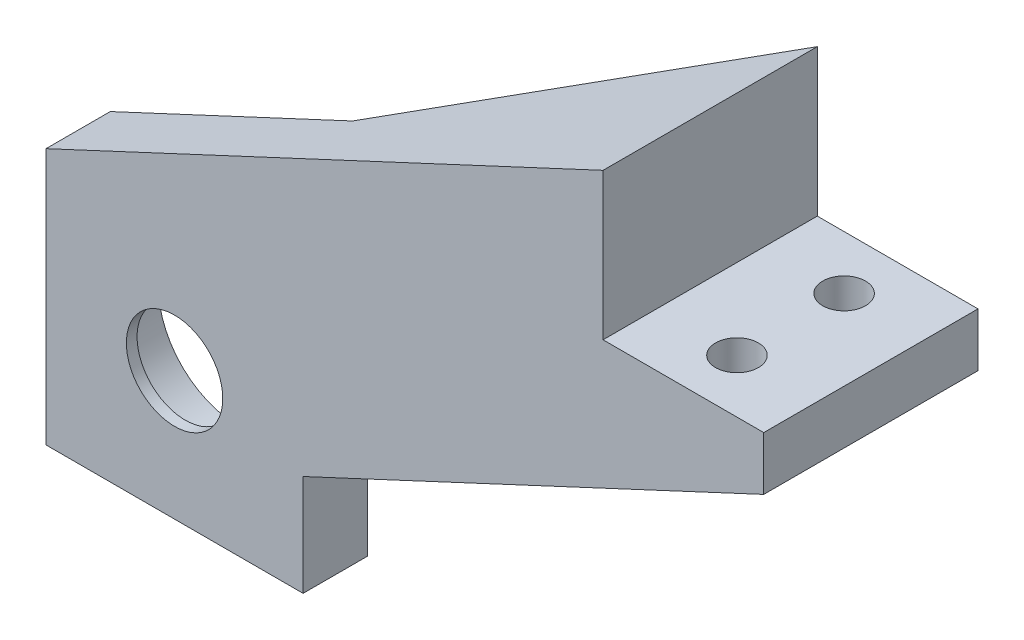
ISO-10303-21;
HEADER;
FILE_DESCRIPTION(('STEP AP214'),'2;1');
FILE_NAME('part.step','',(''),(''),'','','');
FILE_SCHEMA(('AUTOMOTIVE_DESIGN { 1 0 10303 214 1 1 1 1 }'));
ENDSEC;
DATA;
#1=APPLICATION_CONTEXT('core data for automotive mechanical design processes');
#2=APPLICATION_PROTOCOL_DEFINITION('international standard','automotive_design',2000,#1);
#3=PRODUCT_CONTEXT('',#1,'mechanical');
#4=PRODUCT('Part','Part','',(#3));
#5=PRODUCT_RELATED_PRODUCT_CATEGORY('part','',(#4));
#6=PRODUCT_DEFINITION_FORMATION('','',#4);
#7=PRODUCT_DEFINITION_CONTEXT('part definition',#1,'design');
#8=PRODUCT_DEFINITION('design','',#6,#7);
#9=PRODUCT_DEFINITION_SHAPE('','',#8);
#10=(LENGTH_UNIT() NAMED_UNIT(*) SI_UNIT(.MILLI.,.METRE.));
#11=(NAMED_UNIT(*) PLANE_ANGLE_UNIT() SI_UNIT($,.RADIAN.));
#12=(NAMED_UNIT(*) SI_UNIT($,.STERADIAN.) SOLID_ANGLE_UNIT());
#13=UNCERTAINTY_MEASURE_WITH_UNIT(LENGTH_MEASURE(1.E-05),#10,'distance_accuracy_value','');
#14=(GEOMETRIC_REPRESENTATION_CONTEXT(3) GLOBAL_UNCERTAINTY_ASSIGNED_CONTEXT((#13)) GLOBAL_UNIT_ASSIGNED_CONTEXT((#10,
#11,#12)) REPRESENTATION_CONTEXT('',''));
#15=CARTESIAN_POINT('',(0.,0.,0.));
#16=DIRECTION('',(0.,0.,1.));
#17=DIRECTION('',(1.,0.,0.));
#18=AXIS2_PLACEMENT_3D('',#15,#16,#17);
#19=CARTESIAN_POINT('',(0.,22.5000000000014,-87.5362950464834));
#20=DIRECTION('',(0.,1.,0.));
#21=DIRECTION('',(-1.,0.,0.));
#22=AXIS2_PLACEMENT_3D('',#19,#20,#21);
#23=PLANE('',#22);
#24=CARTESIAN_POINT('',(47.5000000000003,22.5000000000012,-4.00000000000001));
#25=DIRECTION('',(0.,-1.,0.));
#26=DIRECTION('',(0.,0.,-1.));
#27=AXIS2_PLACEMENT_3D('',#24,#25,#26);
#28=CIRCLE('',#27,2.);
#29=CARTESIAN_POINT('',(47.5000000000003,22.5000000000012,-6.));
#30=VERTEX_POINT('',#29);
#31=EDGE_CURVE('E245',#30,#30,#28,.F.);
#32=ORIENTED_EDGE('',*,*,#31,.F.);
#33=EDGE_LOOP('',(#32));
#34=FACE_BOUND('',#33,.T.);
#35=CARTESIAN_POINT('',(47.5000000000003,22.5000000000012,-14.));
#36=DIRECTION('',(0.,-1.,0.));
#37=DIRECTION('',(0.,0.,-1.));
#38=AXIS2_PLACEMENT_3D('',#35,#36,#37);
#39=CIRCLE('',#38,2.);
#40=CARTESIAN_POINT('',(47.5000000000003,22.5000000000012,-16.));
#41=VERTEX_POINT('',#40);
#42=EDGE_CURVE('E276',#41,#41,#39,.T.);
#43=ORIENTED_EDGE('',*,*,#42,.T.);
#44=EDGE_LOOP('',(#43));
#45=FACE_BOUND('',#44,.T.);
#46=DIRECTION('',(-1.,0.,0.));
#47=VECTOR('',#46,1.);
#48=CARTESIAN_POINT('',(0.,22.5000000000012,-19.0000000000001));
#49=LINE('',#48,#47);
#50=CARTESIAN_POINT('',(55.0000000000003,22.5000000000012,-19.));
#51=VERTEX_POINT('',#50);
#52=CARTESIAN_POINT('',(40.0000000000003,22.5000000000012,-19.));
#53=VERTEX_POINT('',#52);
#54=EDGE_CURVE('E202',#51,#53,#49,.T.);
#55=ORIENTED_EDGE('',*,*,#54,.T.);
#56=DIRECTION('',(0.,0.,1.));
#57=VECTOR('',#56,1.);
#58=CARTESIAN_POINT('',(40.0000000000003,22.5000000000012,-87.5362950464834));
#59=LINE('',#58,#57);
#60=CARTESIAN_POINT('',(40.0000000000003,22.5000000000012,1.));
#61=VERTEX_POINT('',#60);
#62=EDGE_CURVE('E314',#53,#61,#59,.T.);
#63=ORIENTED_EDGE('',*,*,#62,.T.);
#64=DIRECTION('',(-1.,0.,0.));
#65=VECTOR('',#64,1.);
#66=CARTESIAN_POINT('',(0.,22.5000000000014,1.));
#67=LINE('',#66,#65);
#68=CARTESIAN_POINT('',(55.0000000000003,22.5000000000011,1.));
#69=VERTEX_POINT('',#68);
#70=EDGE_CURVE('E310',#69,#61,#67,.T.);
#71=ORIENTED_EDGE('',*,*,#70,.F.);
#72=DIRECTION('',(0.,0.,1.));
#73=VECTOR('',#72,1.);
#74=CARTESIAN_POINT('',(55.0000000000003,22.5000000000011,-87.5362950464834));
#75=LINE('',#74,#73);
#76=EDGE_CURVE('E320',#51,#69,#75,.T.);
#77=ORIENTED_EDGE('',*,*,#76,.F.);
#78=EDGE_LOOP('',(#55,#63,#71,#77));
#79=FACE_BOUND('',#78,.T.);
#80=ADVANCED_FACE('F35',(#34,#45,#79),#23,.T.);
#81=CARTESIAN_POINT('',(3.12045185632848,-6.69183060101346,-87.5362950464834));
#82=DIRECTION('',(-0.422618261740692,0.906307787036653,0.));
#83=DIRECTION('',(-0.906307787036654,-0.422618261740692,0.));
#84=AXIS2_PLACEMENT_3D('',#81,#82,#83);
#85=PLANE('',#84);
#86=DIRECTION('',(-0.803018297611856,-0.37445358181499,-0.4636228302904));
#87=VECTOR('',#86,1.);
#88=CARTESIAN_POINT('',(-16.9360766604947,-16.044343444412,-45.2436380897875));
#89=LINE('',#88,#87);
#90=CARTESIAN_POINT('',(51.0000000000003,15.6347693673812,-6.02072594216368));
#91=VERTEX_POINT('',#90);
#92=CARTESIAN_POINT('',(47.5000000000003,14.0026925638387,-8.04145188432738));
#93=VERTEX_POINT('',#92);
#94=EDGE_CURVE('E43',#91,#93,#89,.T.);
#95=ORIENTED_EDGE('',*,*,#94,.T.);
#96=DIRECTION('',(-0.803018297611856,-0.37445358181499,0.463622830290401));
#97=VECTOR('',#96,1.);
#98=CARTESIAN_POINT('',(42.2554045129276,11.5570975242916,-5.01348326807526));
#99=LINE('',#98,#97);
#100=CARTESIAN_POINT('',(44.0000000000003,12.3706157602962,-6.02072594216369));
#101=VERTEX_POINT('',#100);
#102=EDGE_CURVE('E11',#93,#101,#99,.T.);
#103=ORIENTED_EDGE('',*,*,#102,.T.);
#104=DIRECTION('',(0.,0.,1.));
#105=VECTOR('',#104,1.);
#106=CARTESIAN_POINT('',(44.0000000000003,12.3706157602962,-87.5362950464834));
#107=LINE('',#106,#105);
#108=CARTESIAN_POINT('',(44.0000000000003,12.3706157602962,-1.97927405783631));
#109=VERTEX_POINT('',#108);
#110=EDGE_CURVE('E361',#101,#109,#107,.T.);
#111=ORIENTED_EDGE('',*,*,#110,.T.);
#112=DIRECTION('',(0.803018297611856,0.37445358181499,0.4636228302904));
#113=VECTOR('',#112,1.);
#114=CARTESIAN_POINT('',(-19.9453224632255,-17.4475778074961,-38.8981231953971));
#115=LINE('',#114,#113);
#116=CARTESIAN_POINT('',(47.5000000000003,14.0026925638387,0.0414518843273807));
#117=VERTEX_POINT('',#116);
#118=EDGE_CURVE('E364',#109,#117,#115,.T.);
#119=ORIENTED_EDGE('',*,*,#118,.T.);
#120=DIRECTION('',(0.803018297611856,0.37445358181499,-0.4636228302904));
#121=VECTOR('',#120,1.);
#122=CARTESIAN_POINT('',(45.2646503156582,12.9603318873757,1.33203162631521));
#123=LINE('',#122,#121);
#124=CARTESIAN_POINT('',(51.0000000000003,15.6347693673812,-1.97927405783632));
#125=VERTEX_POINT('',#124);
#126=EDGE_CURVE('E367',#117,#125,#123,.T.);
#127=ORIENTED_EDGE('',*,*,#126,.T.);
#128=DIRECTION('',(0.,0.,-1.));
#129=VECTOR('',#128,1.);
#130=CARTESIAN_POINT('',(51.0000000000003,15.6347693673812,-87.5362950464834));
#131=LINE('',#130,#129);
#132=EDGE_CURVE('E370',#125,#91,#131,.T.);
#133=ORIENTED_EDGE('',*,*,#132,.T.);
#134=EDGE_LOOP('',(#95,#103,#111,#119,#127,#133));
#135=FACE_BOUND('',#134,.T.);
#136=DIRECTION('',(0.,0.,1.));
#137=VECTOR('',#136,1.);
#138=CARTESIAN_POINT('',(12.,-2.55122930066351,-87.5362950464834));
#139=LINE('',#138,#137);
#140=CARTESIAN_POINT('',(12.,-2.55122930066349,-5.));
#141=VERTEX_POINT('',#140);
#142=CARTESIAN_POINT('',(12.,-2.55122930066351,1.));
#143=VERTEX_POINT('',#142);
#144=EDGE_CURVE('E299',#141,#143,#139,.T.);
#145=ORIENTED_EDGE('',*,*,#144,.F.);
#146=DIRECTION('',(0.906307787036654,0.422618261740692,0.));
#147=VECTOR('',#146,1.);
#148=CARTESIAN_POINT('',(-12.8853882092916,-14.155476398816,-5.));
#149=LINE('',#148,#147);
#150=CARTESIAN_POINT('',(10.6202551890186,-3.19461487232375,-5.));
#151=VERTEX_POINT('',#150);
#152=EDGE_CURVE('E284',#151,#141,#149,.T.);
#153=ORIENTED_EDGE('',*,*,#152,.F.);
#154=DIRECTION('',(0.832030557119117,0.387982220603606,-0.396478181638721));
#155=VECTOR('',#154,1.);
#156=CARTESIAN_POINT('',(-10.8398296172416,-13.2016167621384,5.22613331805873));
#157=LINE('',#156,#155);
#158=CARTESIAN_POINT('',(40.0000000000003,10.5053851276763,-19.));
#159=VERTEX_POINT('',#158);
#160=EDGE_CURVE('E200',#151,#159,#157,.T.);
#161=ORIENTED_EDGE('',*,*,#160,.T.);
#162=DIRECTION('',(0.906307787036654,0.422618261740692,0.));
#163=VECTOR('',#162,1.);
#164=CARTESIAN_POINT('',(-12.8853882092915,-14.155476398816,-19.0000000000001));
#165=LINE('',#164,#163);
#166=CARTESIAN_POINT('',(55.0000000000003,17.5000000000011,-19.));
#167=VERTEX_POINT('',#166);
#168=EDGE_CURVE('E281',#159,#167,#165,.T.);
#169=ORIENTED_EDGE('',*,*,#168,.T.);
#170=DIRECTION('',(0.,0.,1.));
#171=VECTOR('',#170,1.);
#172=CARTESIAN_POINT('',(55.0000000000003,17.5000000000011,-87.5362950464834));
#173=LINE('',#172,#171);
#174=CARTESIAN_POINT('',(55.0000000000003,17.5000000000011,1.));
#175=VERTEX_POINT('',#174);
#176=EDGE_CURVE('E286',#167,#175,#173,.T.);
#177=ORIENTED_EDGE('',*,*,#176,.T.);
#178=DIRECTION('',(-0.906307787036653,-0.422618261740692,0.));
#179=VECTOR('',#178,1.);
#180=CARTESIAN_POINT('',(3.12045185632848,-6.69183060101346,1.));
#181=LINE('',#180,#179);
#182=EDGE_CURVE('E321',#175,#143,#181,.T.);
#183=ORIENTED_EDGE('',*,*,#182,.T.);
#184=EDGE_LOOP('',(#145,#153,#161,#169,#177,#183));
#185=FACE_BOUND('',#184,.T.);
#186=DIRECTION('',(0.,0.,1.));
#187=VECTOR('',#186,1.);
#188=CARTESIAN_POINT('',(51.0000000000003,15.6347693673812,-87.5362950464834));
#189=LINE('',#188,#187);
#190=CARTESIAN_POINT('',(51.0000000000003,15.6347693673812,-16.0207259421637));
#191=VERTEX_POINT('',#190);
#192=CARTESIAN_POINT('',(51.0000000000003,15.6347693673812,-11.9792740578363));
#193=VERTEX_POINT('',#192);
#194=EDGE_CURVE('E359',#191,#193,#189,.T.);
#195=ORIENTED_EDGE('',*,*,#194,.F.);
#196=DIRECTION('',(0.803018297611856,0.37445358181499,0.4636228302904));
#197=VECTOR('',#196,1.);
#198=CARTESIAN_POINT('',(-13.2131005013568,-14.3082911502776,-53.0941768021227));
#199=LINE('',#198,#197);
#200=CARTESIAN_POINT('',(47.5000000000003,14.0026925638387,-18.0414518843274));
#201=VERTEX_POINT('',#200);
#202=EDGE_CURVE('E347',#201,#191,#199,.T.);
#203=ORIENTED_EDGE('',*,*,#202,.F.);
#204=DIRECTION('',(0.803018297611856,0.37445358181499,-0.4636228302904));
#205=VECTOR('',#204,1.);
#206=CARTESIAN_POINT('',(38.5324283537896,9.82104523015715,-12.8640219804104));
#207=LINE('',#206,#205);
#208=CARTESIAN_POINT('',(44.0000000000003,12.3706157602962,-16.0207259421637));
#209=VERTEX_POINT('',#208);
#210=EDGE_CURVE('E351',#209,#201,#207,.T.);
#211=ORIENTED_EDGE('',*,*,#210,.F.);
#212=DIRECTION('',(0.,0.,-1.));
#213=VECTOR('',#212,1.);
#214=CARTESIAN_POINT('',(44.0000000000003,12.3706157602962,-87.5362950464834));
#215=LINE('',#214,#213);
#216=CARTESIAN_POINT('',(44.0000000000003,12.3706157602962,-11.9792740578363));
#217=VERTEX_POINT('',#216);
#218=EDGE_CURVE('E353',#217,#209,#215,.T.);
#219=ORIENTED_EDGE('',*,*,#218,.F.);
#220=DIRECTION('',(-0.803018297611856,-0.37445358181499,-0.463622830290401));
#221=VECTOR('',#220,1.);
#222=CARTESIAN_POINT('',(-16.2223463040876,-15.7115255133617,-46.7486619077324));
#223=LINE('',#222,#221);
#224=CARTESIAN_POINT('',(47.5000000000003,14.0026925638387,-9.95854811567263));
#225=VERTEX_POINT('',#224);
#226=EDGE_CURVE('E355',#225,#217,#223,.T.);
#227=ORIENTED_EDGE('',*,*,#226,.F.);
#228=DIRECTION('',(-0.803018297611856,-0.37445358181499,0.4636228302904));
#229=VECTOR('',#228,1.);
#230=CARTESIAN_POINT('',(41.5416741565203,11.2242795932412,-6.51850708602002));
#231=LINE('',#230,#229);
#232=EDGE_CURVE('E357',#193,#225,#231,.T.);
#233=ORIENTED_EDGE('',*,*,#232,.F.);
#234=EDGE_LOOP('',(#195,#203,#211,#219,#227,#233));
#235=FACE_BOUND('',#234,.T.);
#236=ADVANCED_FACE('F374',(#135,#185,#235),#85,.F.);
#237=CARTESIAN_POINT('',(47.5000000000003,-12.,-4.));
#238=DIRECTION('',(0.,1.,0.));
#239=DIRECTION('',(0.,0.,1.));
#240=AXIS2_PLACEMENT_3D('',#237,#238,#239);
#241=CYLINDRICAL_SURFACE('',#240,2.);
#242=ORIENTED_EDGE('',*,*,#31,.T.);
#243=EDGE_LOOP('',(#242));
#244=FACE_BOUND('',#243,.T.);
#245=CARTESIAN_POINT('',(47.5000000000003,19.5000000000012,-4.00000000000001));
#246=DIRECTION('',(0.,-1.,0.));
#247=DIRECTION('',(0.,0.,-1.));
#248=AXIS2_PLACEMENT_3D('',#245,#246,#247);
#249=CIRCLE('',#248,2.);
#250=CARTESIAN_POINT('',(47.5000000000003,19.5000000000012,-6.));
#251=VERTEX_POINT('',#250);
#252=EDGE_CURVE('E231',#251,#251,#249,.F.);
#253=ORIENTED_EDGE('',*,*,#252,.F.);
#254=EDGE_LOOP('',(#253));
#255=FACE_BOUND('',#254,.T.);
#256=ADVANCED_FACE('F418',(#244,#255),#241,.F.);
#257=CARTESIAN_POINT('',(47.5000000000003,-12.,-14.));
#258=DIRECTION('',(0.,1.,0.));
#259=DIRECTION('',(0.,0.,1.));
#260=AXIS2_PLACEMENT_3D('',#257,#258,#259);
#261=CYLINDRICAL_SURFACE('',#260,2.);
#262=ORIENTED_EDGE('',*,*,#42,.F.);
#263=EDGE_LOOP('',(#262));
#264=FACE_BOUND('',#263,.T.);
#265=CARTESIAN_POINT('',(47.5000000000003,19.5000000000012,-14.));
#266=DIRECTION('',(0.,-1.,0.));
#267=DIRECTION('',(0.,0.,-1.));
#268=AXIS2_PLACEMENT_3D('',#265,#266,#267);
#269=CIRCLE('',#268,2.);
#270=CARTESIAN_POINT('',(47.5000000000003,19.5000000000012,-16.));
#271=VERTEX_POINT('',#270);
#272=EDGE_CURVE('E210',#271,#271,#269,.T.);
#273=ORIENTED_EDGE('',*,*,#272,.T.);
#274=EDGE_LOOP('',(#273));
#275=FACE_BOUND('',#274,.T.);
#276=ADVANCED_FACE('F456',(#264,#275),#261,.F.);
#277=CARTESIAN_POINT('',(0.,0.,-5.));
#278=DIRECTION('',(0.,0.,-1.));
#279=DIRECTION('',(0.,-1.,0.));
#280=AXIS2_PLACEMENT_3D('',#277,#278,#279);
#281=PLANE('',#280);
#282=CARTESIAN_POINT('',(0.,0.,-5.));
#283=DIRECTION('',(0.,0.,-1.));
#284=DIRECTION('',(-1.,0.,0.));
#285=AXIS2_PLACEMENT_3D('',#282,#283,#284);
#286=CIRCLE('',#285,7.5);
#287=CARTESIAN_POINT('',(7.5,0.,-5.));
#288=VERTEX_POINT('',#287);
#289=EDGE_CURVE('E344',#288,#288,#286,.F.);
#290=ORIENTED_EDGE('',*,*,#289,.T.);
#291=EDGE_LOOP('',(#290));
#292=FACE_BOUND('',#291,.T.);
#293=DIRECTION('',(0.,1.,0.));
#294=VECTOR('',#293,1.);
#295=CARTESIAN_POINT('',(10.6202551890186,-41.7882805870946,-4.99999999999999));
#296=LINE('',#295,#294);
#297=CARTESIAN_POINT('',(10.6202551890186,22.5000000000012,-5.));
#298=VERTEX_POINT('',#297);
#299=EDGE_CURVE('E184',#151,#298,#296,.T.);
#300=ORIENTED_EDGE('',*,*,#299,.F.);
#301=ORIENTED_EDGE('',*,*,#152,.T.);
#302=DIRECTION('',(0.,-1.,0.));
#303=VECTOR('',#302,1.);
#304=CARTESIAN_POINT('',(12.,0.,-5.));
#305=LINE('',#304,#303);
#306=CARTESIAN_POINT('',(12.,-12.,-5.));
#307=VERTEX_POINT('',#306);
#308=EDGE_CURVE('E303',#141,#307,#305,.T.);
#309=ORIENTED_EDGE('',*,*,#308,.T.);
#310=DIRECTION('',(1.,0.,0.));
#311=VECTOR('',#310,1.);
#312=CARTESIAN_POINT('',(0.,-12.,-5.));
#313=LINE('',#312,#311);
#314=CARTESIAN_POINT('',(-12.,-12.,-5.));
#315=VERTEX_POINT('',#314);
#316=EDGE_CURVE('E298',#315,#307,#313,.T.);
#317=ORIENTED_EDGE('',*,*,#316,.F.);
#318=DIRECTION('',(0.,1.,0.));
#319=VECTOR('',#318,1.);
#320=CARTESIAN_POINT('',(-12.,0.,-5.));
#321=LINE('',#320,#319);
#322=CARTESIAN_POINT('',(-12.,11.9520017759417,-5.));
#323=VERTEX_POINT('',#322);
#324=EDGE_CURVE('E186',#315,#323,#321,.T.);
#325=ORIENTED_EDGE('',*,*,#324,.T.);
#326=DIRECTION('',(-0.906307787036653,-0.422618261740692,0.));
#327=VECTOR('',#326,1.);
#328=CARTESIAN_POINT('',(-6.72115661418476,14.4135668729481,-5.));
#329=LINE('',#328,#327);
#330=EDGE_CURVE('E181',#298,#323,#329,.T.);
#331=ORIENTED_EDGE('',*,*,#330,.F.);
#332=EDGE_LOOP('',(#300,#301,#309,#317,#325,#331));
#333=FACE_BOUND('',#332,.T.);
#334=ADVANCED_FACE('F183',(#292,#333),#281,.T.);
#335=CARTESIAN_POINT('',(0.,0.,-33.2842712474619));
#336=DIRECTION('',(0.,0.,1.));
#337=DIRECTION('',(1.,0.,0.));
#338=AXIS2_PLACEMENT_3D('',#335,#336,#337);
#339=CYLINDRICAL_SURFACE('',#338,7.5);
#340=CARTESIAN_POINT('',(0.,0.,0.));
#341=DIRECTION('',(0.,0.,1.));
#342=DIRECTION('',(1.,0.,0.));
#343=AXIS2_PLACEMENT_3D('',#340,#341,#342);
#344=CIRCLE('',#343,7.5);
#345=CARTESIAN_POINT('',(7.5,0.,0.));
#346=VERTEX_POINT('',#345);
#347=EDGE_CURVE('E341',#346,#346,#344,.T.);
#348=CARTESIAN_POINT('',(7.5,0.,0.));
#349=CARTESIAN_POINT('',(7.5,0.,-0.0520833333333392));
#350=CARTESIAN_POINT('',(7.5,0.,-0.104166666666671));
#351=CARTESIAN_POINT('',(7.5,0.,-0.208333333333338));
#352=CARTESIAN_POINT('',(7.5,0.,-0.260416666666673));
#353=CARTESIAN_POINT('',(7.5,0.,-0.364583333333339));
#354=CARTESIAN_POINT('',(7.5,0.,-0.416666666666672));
#355=CARTESIAN_POINT('',(7.5,0.,-0.520833333333338));
#356=CARTESIAN_POINT('',(7.5,0.,-0.572916666666673));
#357=CARTESIAN_POINT('',(7.5,0.,-0.67708333333334));
#358=CARTESIAN_POINT('',(7.5,0.,-0.729166666666672));
#359=CARTESIAN_POINT('',(7.5,0.,-0.833333333333339));
#360=CARTESIAN_POINT('',(7.5,0.,-0.885416666666673));
#361=CARTESIAN_POINT('',(7.5,0.,-0.98958333333334));
#362=CARTESIAN_POINT('',(7.5,0.,-1.04166666666667));
#363=CARTESIAN_POINT('',(7.5,0.,-1.14583333333334));
#364=CARTESIAN_POINT('',(7.5,0.,-1.19791666666667));
#365=CARTESIAN_POINT('',(7.5,0.,-1.30208333333334));
#366=CARTESIAN_POINT('',(7.5,0.,-1.35416666666667));
#367=CARTESIAN_POINT('',(7.5,0.,-1.45833333333334));
#368=CARTESIAN_POINT('',(7.5,0.,-1.51041666666667));
#369=CARTESIAN_POINT('',(7.5,0.,-1.61458333333334));
#370=CARTESIAN_POINT('',(7.5,0.,-1.66666666666667));
#371=CARTESIAN_POINT('',(7.5,0.,-1.77083333333334));
#372=CARTESIAN_POINT('',(7.5,0.,-1.82291666666667));
#373=CARTESIAN_POINT('',(7.5,0.,-1.92708333333334));
#374=CARTESIAN_POINT('',(7.5,0.,-1.97916666666667));
#375=CARTESIAN_POINT('',(7.5,0.,-2.08333333333334));
#376=CARTESIAN_POINT('',(7.5,0.,-2.13541666666667));
#377=CARTESIAN_POINT('',(7.5,0.,-2.23958333333334));
#378=CARTESIAN_POINT('',(7.5,0.,-2.29166666666667));
#379=CARTESIAN_POINT('',(7.5,0.,-2.39583333333334));
#380=CARTESIAN_POINT('',(7.5,0.,-2.44791666666667));
#381=CARTESIAN_POINT('',(7.5,0.,-2.55208333333334));
#382=CARTESIAN_POINT('',(7.5,0.,-2.60416666666667));
#383=CARTESIAN_POINT('',(7.5,0.,-2.70833333333334));
#384=CARTESIAN_POINT('',(7.5,0.,-2.76041666666667));
#385=CARTESIAN_POINT('',(7.5,0.,-2.86458333333334));
#386=CARTESIAN_POINT('',(7.5,0.,-2.91666666666667));
#387=CARTESIAN_POINT('',(7.5,0.,-3.02083333333334));
#388=CARTESIAN_POINT('',(7.5,0.,-3.07291666666667));
#389=CARTESIAN_POINT('',(7.5,0.,-3.17708333333334));
#390=CARTESIAN_POINT('',(7.5,0.,-3.22916666666667));
#391=CARTESIAN_POINT('',(7.5,0.,-3.33333333333334));
#392=CARTESIAN_POINT('',(7.5,0.,-3.38541666666667));
#393=CARTESIAN_POINT('',(7.5,0.,-3.48958333333334));
#394=CARTESIAN_POINT('',(7.5,0.,-3.54166666666667));
#395=CARTESIAN_POINT('',(7.5,0.,-3.64583333333334));
#396=CARTESIAN_POINT('',(7.5,0.,-3.69791666666667));
#397=CARTESIAN_POINT('',(7.5,0.,-3.80208333333333));
#398=CARTESIAN_POINT('',(7.5,0.,-3.85416666666667));
#399=CARTESIAN_POINT('',(7.5,0.,-3.95833333333334));
#400=CARTESIAN_POINT('',(7.5,0.,-4.01041666666667));
#401=CARTESIAN_POINT('',(7.5,0.,-4.11458333333333));
#402=CARTESIAN_POINT('',(7.5,0.,-4.16666666666667));
#403=CARTESIAN_POINT('',(7.5,0.,-4.27083333333333));
#404=CARTESIAN_POINT('',(7.5,0.,-4.32291666666667));
#405=CARTESIAN_POINT('',(7.5,0.,-4.42708333333333));
#406=CARTESIAN_POINT('',(7.5,0.,-4.47916666666667));
#407=CARTESIAN_POINT('',(7.5,0.,-4.58333333333333));
#408=CARTESIAN_POINT('',(7.5,0.,-4.63541666666667));
#409=CARTESIAN_POINT('',(7.5,0.,-4.73958333333333));
#410=CARTESIAN_POINT('',(7.5,0.,-4.79166666666667));
#411=CARTESIAN_POINT('',(7.5,0.,-4.89583333333333));
#412=CARTESIAN_POINT('',(7.5,0.,-4.94791666666667));
#413=CARTESIAN_POINT('',(7.5,0.,-5.));
#414=B_SPLINE_CURVE_WITH_KNOTS('',3,(#348,#349,#350,#351,#352,#353,#354,#355,#356,#357,#358,
#359,#360,#361,#362,#363,#364,#365,#366,#367,#368,#369,#370,#371,#372,#373,#374,#375,#376,#377,
#378,#379,#380,#381,#382,#383,#384,#385,#386,#387,#388,#389,#390,#391,#392,#393,#394,#395,#396,
#397,#398,#399,#400,#401,#402,#403,#404,#405,#406,#407,#408,#409,#410,#411,#412,#413),
.UNSPECIFIED.,.F.,.F.,(4,2,2,2,2,2,2,2,2,2,2,2,2,2,2,2,2,2,2,2,2,2,2,2,2,2,2,2,2,2,2,2,4),(0.,
0.156249999999997,0.3125,0.468749999999997,0.625000000000001,0.781249999999997,
0.937500000000001,1.09375,1.25,1.40625,1.5625,1.71875,1.875,2.03125,2.1875,2.34375,2.5,2.65625,
2.8125,2.96875,3.125,3.28125,3.4375,3.59375,3.74999999999999,3.90625,4.06249999999999,
4.21874999999999,4.37499999999999,4.53124999999999,4.68749999999999,4.84374999999999,
4.99999999999999),.UNSPECIFIED.);
#415=EDGE_CURVE('BSEAM37',#346,#288,#414,.T.);
#416=ORIENTED_EDGE('',*,*,#347,.T.);
#417=ORIENTED_EDGE('',*,*,#289,.F.);
#418=ORIENTED_EDGE('',*,*,#415,.T.);
#419=ORIENTED_EDGE('',*,*,#415,.F.);
#420=EDGE_LOOP('',(#416,#418,#417,#419));
#421=FACE_BOUND('',#420,.T.);
#422=ADVANCED_FACE('F37',(#421),#339,.F.);
#423=CARTESIAN_POINT('',(0.,0.,0.));
#424=DIRECTION('',(0.,0.,1.));
#425=DIRECTION('',(1.,0.,0.));
#426=AXIS2_PLACEMENT_3D('',#423,#424,#425);
#427=PLANE('',#426);
#428=CARTESIAN_POINT('',(0.,0.,0.));
#429=DIRECTION('',(0.,0.,1.));
#430=DIRECTION('',(1.,0.,0.));
#431=AXIS2_PLACEMENT_3D('',#428,#429,#430);
#432=CIRCLE('',#431,4.5);
#433=CARTESIAN_POINT('',(4.5,0.,0.));
#434=VERTEX_POINT('',#433);
#435=EDGE_CURVE('E328',#434,#434,#432,.T.);
#436=ORIENTED_EDGE('',*,*,#435,.T.);
#437=EDGE_LOOP('',(#436));
#438=FACE_BOUND('',#437,.T.);
#439=ORIENTED_EDGE('',*,*,#347,.F.);
#440=EDGE_LOOP('',(#439));
#441=FACE_BOUND('',#440,.T.);
#442=ADVANCED_FACE('F449',(#438,#441),#427,.F.);
#443=CARTESIAN_POINT('',(0.,0.,1.));
#444=DIRECTION('',(0.,0.,-1.));
#445=DIRECTION('',(-1.,0.,0.));
#446=AXIS2_PLACEMENT_3D('',#443,#444,#445);
#447=CYLINDRICAL_SURFACE('',#446,4.5);
#448=CARTESIAN_POINT('',(0.,0.,1.));
#449=DIRECTION('',(0.,0.,1.));
#450=DIRECTION('',(1.,0.,0.));
#451=AXIS2_PLACEMENT_3D('',#448,#449,#450);
#452=CIRCLE('',#451,4.5);
#453=CARTESIAN_POINT('',(4.5,0.,1.));
#454=VERTEX_POINT('',#453);
#455=EDGE_CURVE('E338',#454,#454,#452,.T.);
#456=ORIENTED_EDGE('',*,*,#455,.T.);
#457=EDGE_LOOP('',(#456));
#458=FACE_BOUND('',#457,.T.);
#459=ORIENTED_EDGE('',*,*,#435,.F.);
#460=EDGE_LOOP('',(#459));
#461=FACE_BOUND('',#460,.T.);
#462=ADVANCED_FACE('F447',(#458,#461),#447,.F.);
#463=CARTESIAN_POINT('',(0.,0.,1.));
#464=DIRECTION('',(0.,0.,1.));
#465=DIRECTION('',(1.,0.,0.));
#466=AXIS2_PLACEMENT_3D('',#463,#464,#465);
#467=PLANE('',#466);
#468=ORIENTED_EDGE('',*,*,#455,.F.);
#469=EDGE_LOOP('',(#468));
#470=FACE_BOUND('',#469,.T.);
#471=ORIENTED_EDGE('',*,*,#182,.F.);
#472=DIRECTION('',(0.,1.,0.));
#473=VECTOR('',#472,1.);
#474=CARTESIAN_POINT('',(55.0000000000004,1.5265566588596E-13,1.));
#475=LINE('',#474,#473);
#476=EDGE_CURVE('E317',#175,#69,#475,.T.);
#477=ORIENTED_EDGE('',*,*,#476,.T.);
#478=ORIENTED_EDGE('',*,*,#70,.T.);
#479=DIRECTION('',(0.,-1.,0.));
#480=VECTOR('',#479,1.);
#481=CARTESIAN_POINT('',(40.0000000000004,1.41816809714894E-13,1.));
#482=LINE('',#481,#480);
#483=CARTESIAN_POINT('',(40.0000000000003,36.2000000000012,1.));
#484=VERTEX_POINT('',#483);
#485=EDGE_CURVE('E311',#484,#61,#482,.T.);
#486=ORIENTED_EDGE('',*,*,#485,.F.);
#487=DIRECTION('',(-0.906307787036653,-0.422618261740692,0.));
#488=VECTOR('',#487,1.);
#489=CARTESIAN_POINT('',(-6.72115661418476,14.4135668729481,1.));
#490=LINE('',#489,#488);
#491=CARTESIAN_POINT('',(-12.,11.9520017759417,1.));
#492=VERTEX_POINT('',#491);
#493=EDGE_CURVE('E304',#484,#492,#490,.T.);
#494=ORIENTED_EDGE('',*,*,#493,.T.);
#495=DIRECTION('',(0.,1.,0.));
#496=VECTOR('',#495,1.);
#497=CARTESIAN_POINT('',(-12.,0.,1.));
#498=LINE('',#497,#496);
#499=CARTESIAN_POINT('',(-12.,-12.,1.));
#500=VERTEX_POINT('',#499);
#501=EDGE_CURVE('E191',#500,#492,#498,.T.);
#502=ORIENTED_EDGE('',*,*,#501,.F.);
#503=DIRECTION('',(1.,0.,0.));
#504=VECTOR('',#503,1.);
#505=CARTESIAN_POINT('',(0.,-12.,1.));
#506=LINE('',#505,#504);
#507=CARTESIAN_POINT('',(12.,-12.,1.));
#508=VERTEX_POINT('',#507);
#509=EDGE_CURVE('E300',#500,#508,#506,.T.);
#510=ORIENTED_EDGE('',*,*,#509,.T.);
#511=DIRECTION('',(0.,-1.,0.));
#512=VECTOR('',#511,1.);
#513=CARTESIAN_POINT('',(12.,0.,1.));
#514=LINE('',#513,#512);
#515=EDGE_CURVE('E295',#143,#508,#514,.T.);
#516=ORIENTED_EDGE('',*,*,#515,.F.);
#517=EDGE_LOOP('',(#471,#477,#478,#486,#494,#502,#510,#516));
#518=FACE_BOUND('',#517,.T.);
#519=ADVANCED_FACE('F442',(#470,#518),#467,.T.);
#520=CARTESIAN_POINT('',(12.,0.,-87.5362950464834));
#521=DIRECTION('',(-1.,0.,0.));
#522=DIRECTION('',(0.,-1.,0.));
#523=AXIS2_PLACEMENT_3D('',#520,#521,#522);
#524=PLANE('',#523);
#525=ORIENTED_EDGE('',*,*,#308,.F.);
#526=ORIENTED_EDGE('',*,*,#144,.T.);
#527=ORIENTED_EDGE('',*,*,#515,.T.);
#528=DIRECTION('',(0.,0.,1.));
#529=VECTOR('',#528,1.);
#530=CARTESIAN_POINT('',(12.,-12.,-87.5362950464834));
#531=LINE('',#530,#529);
#532=EDGE_CURVE('E327',#307,#508,#531,.T.);
#533=ORIENTED_EDGE('',*,*,#532,.F.);
#534=EDGE_LOOP('',(#525,#526,#527,#533));
#535=FACE_BOUND('',#534,.T.);
#536=ADVANCED_FACE('F439',(#535),#524,.F.);
#537=CARTESIAN_POINT('',(0.,-12.,-87.5362950464834));
#538=DIRECTION('',(0.,-1.,0.));
#539=DIRECTION('',(0.,0.,-1.));
#540=AXIS2_PLACEMENT_3D('',#537,#538,#539);
#541=PLANE('',#540);
#542=DIRECTION('',(0.,0.,1.));
#543=VECTOR('',#542,1.);
#544=CARTESIAN_POINT('',(-12.,-12.,-87.5362950464834));
#545=LINE('',#544,#543);
#546=EDGE_CURVE('E307',#315,#500,#545,.T.);
#547=ORIENTED_EDGE('',*,*,#546,.F.);
#548=ORIENTED_EDGE('',*,*,#316,.T.);
#549=ORIENTED_EDGE('',*,*,#532,.T.);
#550=ORIENTED_EDGE('',*,*,#509,.F.);
#551=EDGE_LOOP('',(#547,#548,#549,#550));
#552=FACE_BOUND('',#551,.T.);
#553=ADVANCED_FACE('F435',(#552),#541,.T.);
#554=CARTESIAN_POINT('',(-12.,0.,-87.5362950464834));
#555=DIRECTION('',(1.,0.,0.));
#556=DIRECTION('',(0.,1.,0.));
#557=AXIS2_PLACEMENT_3D('',#554,#555,#556);
#558=PLANE('',#557);
#559=ORIENTED_EDGE('',*,*,#324,.F.);
#560=ORIENTED_EDGE('',*,*,#546,.T.);
#561=ORIENTED_EDGE('',*,*,#501,.T.);
#562=DIRECTION('',(0.,0.,1.));
#563=VECTOR('',#562,1.);
#564=CARTESIAN_POINT('',(-12.,11.9520017759417,-87.5362950464834));
#565=LINE('',#564,#563);
#566=EDGE_CURVE('E190',#323,#492,#565,.T.);
#567=ORIENTED_EDGE('',*,*,#566,.F.);
#568=EDGE_LOOP('',(#559,#560,#561,#567));
#569=FACE_BOUND('',#568,.T.);
#570=ADVANCED_FACE('F432',(#569),#558,.F.);
#571=CARTESIAN_POINT('',(-6.72115661418476,14.4135668729481,-87.5362950464834));
#572=DIRECTION('',(-0.422618261740692,0.906307787036653,0.));
#573=DIRECTION('',(-0.906307787036653,-0.422618261740692,0.));
#574=AXIS2_PLACEMENT_3D('',#571,#572,#573);
#575=PLANE('',#574);
#576=DIRECTION('',(0.,0.,1.));
#577=VECTOR('',#576,1.);
#578=CARTESIAN_POINT('',(40.0000000000003,36.2000000000012,-87.5362950464834));
#579=LINE('',#578,#577);
#580=CARTESIAN_POINT('',(40.0000000000003,36.2000000000012,-19.));
#581=VERTEX_POINT('',#580);
#582=EDGE_CURVE('E206',#581,#484,#579,.T.);
#583=ORIENTED_EDGE('',*,*,#582,.F.);
#584=DIRECTION('',(-0.832030557119117,-0.387982220603606,0.396478181638721));
#585=VECTOR('',#584,1.);
#586=CARTESIAN_POINT('',(14.878932392875,24.4858537937694,-7.02933964326688));
#587=LINE('',#586,#585);
#588=EDGE_CURVE('E198',#581,#298,#587,.T.);
#589=ORIENTED_EDGE('',*,*,#588,.T.);
#590=ORIENTED_EDGE('',*,*,#330,.T.);
#591=ORIENTED_EDGE('',*,*,#566,.T.);
#592=ORIENTED_EDGE('',*,*,#493,.F.);
#593=EDGE_LOOP('',(#583,#589,#590,#591,#592));
#594=FACE_BOUND('',#593,.T.);
#595=ADVANCED_FACE('F204',(#594),#575,.T.);
#596=CARTESIAN_POINT('',(40.0000000000004,1.41816809714894E-13,-87.5362950464834));
#597=DIRECTION('',(-1.,0.,0.));
#598=DIRECTION('',(0.,-1.,0.));
#599=AXIS2_PLACEMENT_3D('',#596,#597,#598);
#600=PLANE('',#599);
#601=ORIENTED_EDGE('',*,*,#62,.F.);
#602=DIRECTION('',(0.,-1.,0.));
#603=VECTOR('',#602,1.);
#604=CARTESIAN_POINT('',(40.0000000000003,63.5770940688242,-19.));
#605=LINE('',#604,#603);
#606=EDGE_CURVE('E208',#581,#53,#605,.T.);
#607=ORIENTED_EDGE('',*,*,#606,.F.);
#608=ORIENTED_EDGE('',*,*,#582,.T.);
#609=ORIENTED_EDGE('',*,*,#485,.T.);
#610=EDGE_LOOP('',(#601,#607,#608,#609));
#611=FACE_BOUND('',#610,.T.);
#612=ADVANCED_FACE('F426',(#611),#600,.F.);
#613=CARTESIAN_POINT('',(55.0000000000004,1.5265566588596E-13,-87.5362950464834));
#614=DIRECTION('',(1.,0.,0.));
#615=DIRECTION('',(0.,1.,0.));
#616=AXIS2_PLACEMENT_3D('',#613,#614,#615);
#617=PLANE('',#616);
#618=ORIENTED_EDGE('',*,*,#176,.F.);
#619=DIRECTION('',(0.,1.,0.));
#620=VECTOR('',#619,1.);
#621=CARTESIAN_POINT('',(55.0000000000003,-41.7882805870946,-19.));
#622=LINE('',#621,#620);
#623=EDGE_CURVE('E201',#167,#51,#622,.T.);
#624=ORIENTED_EDGE('',*,*,#623,.T.);
#625=ORIENTED_EDGE('',*,*,#76,.T.);
#626=ORIENTED_EDGE('',*,*,#476,.F.);
#627=EDGE_LOOP('',(#618,#624,#625,#626));
#628=FACE_BOUND('',#627,.T.);
#629=ADVANCED_FACE('F424',(#628),#617,.T.);
#630=CARTESIAN_POINT('',(0.,-41.7882805870946,-19.0000000000001));
#631=DIRECTION('',(0.,0.,-1.));
#632=DIRECTION('',(-1.,0.,0.));
#633=AXIS2_PLACEMENT_3D('',#630,#631,#632);
#634=PLANE('',#633);
#635=ORIENTED_EDGE('',*,*,#168,.F.);
#636=DIRECTION('',(0.,1.,0.));
#637=VECTOR('',#636,1.);
#638=CARTESIAN_POINT('',(40.0000000000003,-41.7882805870946,-19.));
#639=LINE('',#638,#637);
#640=EDGE_CURVE('E291',#159,#53,#639,.T.);
#641=ORIENTED_EDGE('',*,*,#640,.T.);
#642=ORIENTED_EDGE('',*,*,#54,.F.);
#643=ORIENTED_EDGE('',*,*,#623,.F.);
#644=EDGE_LOOP('',(#635,#641,#642,#643));
#645=FACE_BOUND('',#644,.T.);
#646=ADVANCED_FACE('F478',(#645),#634,.T.);
#647=CARTESIAN_POINT('',(0.023591958148741,-41.7882805870946,0.049508979285819));
#648=DIRECTION('',(-0.430175153144217,0.,-0.902745444528717));
#649=DIRECTION('',(-0.902745444528717,0.,0.430175153144217));
#650=AXIS2_PLACEMENT_3D('',#647,#648,#649);
#651=PLANE('',#650);
#652=ORIENTED_EDGE('',*,*,#160,.F.);
#653=ORIENTED_EDGE('',*,*,#299,.T.);
#654=ORIENTED_EDGE('',*,*,#588,.F.);
#655=ORIENTED_EDGE('',*,*,#606,.T.);
#656=ORIENTED_EDGE('',*,*,#640,.F.);
#657=EDGE_LOOP('',(#652,#653,#654,#655,#656));
#658=FACE_BOUND('',#657,.T.);
#659=ADVANCED_FACE('F196',(#658),#651,.T.);
#660=CARTESIAN_POINT('',(51.0000000000003,-12.,0.));
#661=DIRECTION('',(-1.,0.,0.));
#662=DIRECTION('',(0.,-1.,0.));
#663=AXIS2_PLACEMENT_3D('',#660,#661,#662);
#664=PLANE('',#663);
#665=ORIENTED_EDGE('',*,*,#194,.T.);
#666=DIRECTION('',(0.,1.,0.));
#667=VECTOR('',#666,1.);
#668=CARTESIAN_POINT('',(51.0000000000003,-12.,-11.9792740578363));
#669=LINE('',#668,#667);
#670=CARTESIAN_POINT('',(51.0000000000003,19.5000000000012,-11.9792740578363));
#671=VERTEX_POINT('',#670);
#672=EDGE_CURVE('E217',#193,#671,#669,.T.);
#673=ORIENTED_EDGE('',*,*,#672,.T.);
#674=DIRECTION('',(0.,0.,1.));
#675=VECTOR('',#674,1.);
#676=CARTESIAN_POINT('',(51.0000000000003,19.5000000000012,0.));
#677=LINE('',#676,#675);
#678=CARTESIAN_POINT('',(51.0000000000003,19.5000000000012,-16.0207259421637));
#679=VERTEX_POINT('',#678);
#680=EDGE_CURVE('E248',#679,#671,#677,.T.);
#681=ORIENTED_EDGE('',*,*,#680,.F.);
#682=DIRECTION('',(0.,1.,0.));
#683=VECTOR('',#682,1.);
#684=CARTESIAN_POINT('',(51.0000000000003,-12.,-16.0207259421637));
#685=LINE('',#684,#683);
#686=EDGE_CURVE('E266',#191,#679,#685,.T.);
#687=ORIENTED_EDGE('',*,*,#686,.F.);
#688=EDGE_LOOP('',(#665,#673,#681,#687));
#689=FACE_BOUND('',#688,.T.);
#690=ADVANCED_FACE('F475',(#689),#664,.T.);
#691=CARTESIAN_POINT('',(7.56282217350897,-12.,13.099192253126));
#692=DIRECTION('',(-0.499999999999999,0.,-0.866025403784439));
#693=DIRECTION('',(-0.866025403784439,0.,0.5));
#694=AXIS2_PLACEMENT_3D('',#691,#692,#693);
#695=PLANE('',#694);
#696=ORIENTED_EDGE('',*,*,#232,.T.);
#697=DIRECTION('',(0.,1.,0.));
#698=VECTOR('',#697,1.);
#699=CARTESIAN_POINT('',(47.5000000000003,-12.,-9.95854811567263));
#700=LINE('',#699,#698);
#701=CARTESIAN_POINT('',(47.5000000000003,19.5000000000012,-9.95854811567264));
#702=VERTEX_POINT('',#701);
#703=EDGE_CURVE('E273',#225,#702,#700,.T.);
#704=ORIENTED_EDGE('',*,*,#703,.T.);
#705=DIRECTION('',(-0.866025403784439,0.,0.5));
#706=VECTOR('',#705,1.);
#707=CARTESIAN_POINT('',(7.56282217350897,19.5000000000012,13.099192253126));
#708=LINE('',#707,#706);
#709=EDGE_CURVE('E251',#671,#702,#708,.T.);
#710=ORIENTED_EDGE('',*,*,#709,.F.);
#711=ORIENTED_EDGE('',*,*,#672,.F.);
#712=EDGE_LOOP('',(#696,#704,#710,#711));
#713=FACE_BOUND('',#712,.T.);
#714=ADVANCED_FACE('F485',(#713),#695,.T.);
#715=CARTESIAN_POINT('',(16.1871778264912,-12.,-28.037014426635));
#716=DIRECTION('',(0.500000000000001,0.,-0.866025403784438));
#717=DIRECTION('',(-0.866025403784438,0.,-0.500000000000001));
#718=AXIS2_PLACEMENT_3D('',#715,#716,#717);
#719=PLANE('',#718);
#720=ORIENTED_EDGE('',*,*,#226,.T.);
#721=DIRECTION('',(0.,1.,0.));
#722=VECTOR('',#721,1.);
#723=CARTESIAN_POINT('',(44.0000000000003,-12.,-11.9792740578363));
#724=LINE('',#723,#722);
#725=CARTESIAN_POINT('',(44.0000000000003,19.5000000000012,-11.9792740578363));
#726=VERTEX_POINT('',#725);
#727=EDGE_CURVE('E271',#217,#726,#724,.T.);
#728=ORIENTED_EDGE('',*,*,#727,.T.);
#729=DIRECTION('',(-0.866025403784438,0.,-0.500000000000001));
#730=VECTOR('',#729,1.);
#731=CARTESIAN_POINT('',(16.1871778264912,19.5000000000012,-28.037014426635));
#732=LINE('',#731,#730);
#733=EDGE_CURVE('E254',#702,#726,#732,.T.);
#734=ORIENTED_EDGE('',*,*,#733,.F.);
#735=ORIENTED_EDGE('',*,*,#703,.F.);
#736=EDGE_LOOP('',(#720,#728,#734,#735));
#737=FACE_BOUND('',#736,.T.);
#738=ADVANCED_FACE('F490',(#737),#719,.T.);
#739=CARTESIAN_POINT('',(44.0000000000003,-12.,0.));
#740=DIRECTION('',(1.,0.,0.));
#741=DIRECTION('',(0.,1.,0.));
#742=AXIS2_PLACEMENT_3D('',#739,#740,#741);
#743=PLANE('',#742);
#744=ORIENTED_EDGE('',*,*,#218,.T.);
#745=DIRECTION('',(0.,1.,0.));
#746=VECTOR('',#745,1.);
#747=CARTESIAN_POINT('',(44.0000000000003,-12.,-16.0207259421637));
#748=LINE('',#747,#746);
#749=CARTESIAN_POINT('',(44.0000000000003,19.5000000000012,-16.0207259421637));
#750=VERTEX_POINT('',#749);
#751=EDGE_CURVE('E269',#209,#750,#748,.T.);
#752=ORIENTED_EDGE('',*,*,#751,.T.);
#753=DIRECTION('',(0.,0.,-1.));
#754=VECTOR('',#753,1.);
#755=CARTESIAN_POINT('',(44.0000000000003,19.5000000000012,0.));
#756=LINE('',#755,#754);
#757=EDGE_CURVE('E257',#726,#750,#756,.T.);
#758=ORIENTED_EDGE('',*,*,#757,.F.);
#759=ORIENTED_EDGE('',*,*,#727,.F.);
#760=EDGE_LOOP('',(#744,#752,#758,#759));
#761=FACE_BOUND('',#760,.T.);
#762=ADVANCED_FACE('F509',(#761),#743,.T.);
#763=CARTESIAN_POINT('',(4.06282217350899,-12.,7.03701442663499));
#764=DIRECTION('',(0.5,0.,0.866025403784439));
#765=DIRECTION('',(0.866025403784439,0.,-0.5));
#766=AXIS2_PLACEMENT_3D('',#763,#764,#765);
#767=PLANE('',#766);
#768=ORIENTED_EDGE('',*,*,#210,.T.);
#769=DIRECTION('',(0.,1.,0.));
#770=VECTOR('',#769,1.);
#771=CARTESIAN_POINT('',(47.5000000000003,-12.,-18.0414518843274));
#772=LINE('',#771,#770);
#773=CARTESIAN_POINT('',(47.5000000000003,19.5000000000012,-18.0414518843274));
#774=VERTEX_POINT('',#773);
#775=EDGE_CURVE('E58',#201,#774,#772,.T.);
#776=ORIENTED_EDGE('',*,*,#775,.T.);
#777=DIRECTION('',(0.866025403784439,0.,-0.5));
#778=VECTOR('',#777,1.);
#779=CARTESIAN_POINT('',(4.06282217350899,19.5000000000012,7.03701442663499));
#780=LINE('',#779,#778);
#781=EDGE_CURVE('E260',#750,#774,#780,.T.);
#782=ORIENTED_EDGE('',*,*,#781,.F.);
#783=ORIENTED_EDGE('',*,*,#751,.F.);
#784=EDGE_LOOP('',(#768,#776,#782,#783));
#785=FACE_BOUND('',#784,.T.);
#786=ADVANCED_FACE('F514',(#785),#767,.T.);
#787=CARTESIAN_POINT('',(19.6871778264911,-12.,-34.0991922531261));
#788=DIRECTION('',(-0.5,0.,0.866025403784439));
#789=DIRECTION('',(0.866025403784439,0.,0.5));
#790=AXIS2_PLACEMENT_3D('',#787,#788,#789);
#791=PLANE('',#790);
#792=ORIENTED_EDGE('',*,*,#202,.T.);
#793=ORIENTED_EDGE('',*,*,#686,.T.);
#794=DIRECTION('',(0.866025403784439,0.,0.5));
#795=VECTOR('',#794,1.);
#796=CARTESIAN_POINT('',(19.6871778264911,19.5000000000012,-34.0991922531261));
#797=LINE('',#796,#795);
#798=EDGE_CURVE('E263',#774,#679,#797,.T.);
#799=ORIENTED_EDGE('',*,*,#798,.F.);
#800=ORIENTED_EDGE('',*,*,#775,.F.);
#801=EDGE_LOOP('',(#792,#793,#799,#800));
#802=FACE_BOUND('',#801,.T.);
#803=ADVANCED_FACE('F409',(#802),#791,.T.);
#804=CARTESIAN_POINT('',(0.,19.5000000000012,0.));
#805=DIRECTION('',(0.,-1.,0.));
#806=DIRECTION('',(0.,0.,-1.));
#807=AXIS2_PLACEMENT_3D('',#804,#805,#806);
#808=PLANE('',#807);
#809=ORIENTED_EDGE('',*,*,#272,.F.);
#810=EDGE_LOOP('',(#809));
#811=FACE_BOUND('',#810,.T.);
#812=ORIENTED_EDGE('',*,*,#680,.T.);
#813=ORIENTED_EDGE('',*,*,#709,.T.);
#814=ORIENTED_EDGE('',*,*,#733,.T.);
#815=ORIENTED_EDGE('',*,*,#757,.T.);
#816=ORIENTED_EDGE('',*,*,#781,.T.);
#817=ORIENTED_EDGE('',*,*,#798,.T.);
#818=EDGE_LOOP('',(#812,#813,#814,#815,#816,#817));
#819=FACE_BOUND('',#818,.T.);
#820=ADVANCED_FACE('F402',(#811,#819),#808,.T.);
#821=CARTESIAN_POINT('',(8.39294919243122,-12.,14.537014426635));
#822=DIRECTION('',(-0.500000000000001,0.,-0.866025403784438));
#823=DIRECTION('',(-0.866025403784438,0.,0.500000000000001));
#824=AXIS2_PLACEMENT_3D('',#821,#822,#823);
#825=PLANE('',#824);
#826=DIRECTION('',(0.,1.,0.));
#827=VECTOR('',#826,1.);
#828=CARTESIAN_POINT('',(47.5000000000003,-12.,-8.04145188432738));
#829=LINE('',#828,#827);
#830=CARTESIAN_POINT('',(47.5000000000003,19.5000000000012,-8.04145188432738));
#831=VERTEX_POINT('',#830);
#832=EDGE_CURVE('E243',#93,#831,#829,.T.);
#833=ORIENTED_EDGE('',*,*,#832,.T.);
#834=DIRECTION('',(-0.866025403784438,0.,0.500000000000001));
#835=VECTOR('',#834,1.);
#836=CARTESIAN_POINT('',(8.39294919243122,19.5000000000012,14.537014426635));
#837=LINE('',#836,#835);
#838=CARTESIAN_POINT('',(44.0000000000003,19.5000000000012,-6.02072594216369));
#839=VERTEX_POINT('',#838);
#840=EDGE_CURVE('E213',#831,#839,#837,.T.);
#841=ORIENTED_EDGE('',*,*,#840,.T.);
#842=DIRECTION('',(0.,1.,0.));
#843=VECTOR('',#842,1.);
#844=CARTESIAN_POINT('',(44.0000000000003,-12.,-6.02072594216368));
#845=LINE('',#844,#843);
#846=EDGE_CURVE('E234',#101,#839,#845,.T.);
#847=ORIENTED_EDGE('',*,*,#846,.F.);
#848=ORIENTED_EDGE('',*,*,#102,.F.);
#849=EDGE_LOOP('',(#833,#841,#847,#848));
#850=FACE_BOUND('',#849,.T.);
#851=ADVANCED_FACE('F399',(#850),#825,.F.);
#852=CARTESIAN_POINT('',(15.3570508075689,-12.,-26.5991922531261));
#853=DIRECTION('',(0.5,0.,-0.866025403784439));
#854=DIRECTION('',(-0.866025403784439,0.,-0.5));
#855=AXIS2_PLACEMENT_3D('',#852,#853,#854);
#856=PLANE('',#855);
#857=DIRECTION('',(0.,1.,0.));
#858=VECTOR('',#857,1.);
#859=CARTESIAN_POINT('',(51.0000000000003,-12.,-6.02072594216368));
#860=LINE('',#859,#858);
#861=CARTESIAN_POINT('',(51.0000000000003,19.5000000000012,-6.02072594216368));
#862=VERTEX_POINT('',#861);
#863=EDGE_CURVE('E241',#91,#862,#860,.T.);
#864=ORIENTED_EDGE('',*,*,#863,.T.);
#865=DIRECTION('',(-0.866025403784439,0.,-0.5));
#866=VECTOR('',#865,1.);
#867=CARTESIAN_POINT('',(15.3570508075689,19.5000000000012,-26.5991922531261));
#868=LINE('',#867,#866);
#869=EDGE_CURVE('E216',#862,#831,#868,.T.);
#870=ORIENTED_EDGE('',*,*,#869,.T.);
#871=ORIENTED_EDGE('',*,*,#832,.F.);
#872=ORIENTED_EDGE('',*,*,#94,.F.);
#873=EDGE_LOOP('',(#864,#870,#871,#872));
#874=FACE_BOUND('',#873,.T.);
#875=ADVANCED_FACE('F379',(#874),#856,.F.);
#876=CARTESIAN_POINT('',(51.0000000000003,-12.,0.));
#877=DIRECTION('',(1.,0.,0.));
#878=DIRECTION('',(0.,1.,0.));
#879=AXIS2_PLACEMENT_3D('',#876,#877,#878);
#880=PLANE('',#879);
#881=DIRECTION('',(0.,1.,0.));
#882=VECTOR('',#881,1.);
#883=CARTESIAN_POINT('',(51.0000000000003,-12.,-1.97927405783631));
#884=LINE('',#883,#882);
#885=CARTESIAN_POINT('',(51.0000000000003,19.5000000000012,-1.97927405783632));
#886=VERTEX_POINT('',#885);
#887=EDGE_CURVE('E239',#125,#886,#884,.T.);
#888=ORIENTED_EDGE('',*,*,#887,.T.);
#889=DIRECTION('',(0.,0.,-1.));
#890=VECTOR('',#889,1.);
#891=CARTESIAN_POINT('',(51.0000000000003,19.5000000000012,0.));
#892=LINE('',#891,#890);
#893=EDGE_CURVE('E220',#886,#862,#892,.T.);
#894=ORIENTED_EDGE('',*,*,#893,.T.);
#895=ORIENTED_EDGE('',*,*,#863,.F.);
#896=ORIENTED_EDGE('',*,*,#132,.F.);
#897=EDGE_LOOP('',(#888,#894,#895,#896));
#898=FACE_BOUND('',#897,.T.);
#899=ADVANCED_FACE('F382',(#898),#880,.F.);
#900=CARTESIAN_POINT('',(11.8929491924312,-12.,20.5991922531261));
#901=DIRECTION('',(0.499999999999999,0.,0.866025403784439));
#902=DIRECTION('',(0.866025403784439,0.,-0.5));
#903=AXIS2_PLACEMENT_3D('',#900,#901,#902);
#904=PLANE('',#903);
#905=DIRECTION('',(0.,1.,0.));
#906=VECTOR('',#905,1.);
#907=CARTESIAN_POINT('',(47.5000000000003,-12.,0.0414518843273853));
#908=LINE('',#907,#906);
#909=CARTESIAN_POINT('',(47.5000000000003,19.5000000000012,0.0414518843273805));
#910=VERTEX_POINT('',#909);
#911=EDGE_CURVE('E237',#117,#910,#908,.T.);
#912=ORIENTED_EDGE('',*,*,#911,.T.);
#913=DIRECTION('',(0.866025403784439,0.,-0.5));
#914=VECTOR('',#913,1.);
#915=CARTESIAN_POINT('',(11.8929491924312,19.5000000000012,20.5991922531261));
#916=LINE('',#915,#914);
#917=EDGE_CURVE('E223',#910,#886,#916,.T.);
#918=ORIENTED_EDGE('',*,*,#917,.T.);
#919=ORIENTED_EDGE('',*,*,#887,.F.);
#920=ORIENTED_EDGE('',*,*,#126,.F.);
#921=EDGE_LOOP('',(#912,#918,#919,#920));
#922=FACE_BOUND('',#921,.T.);
#923=ADVANCED_FACE('F392',(#922),#904,.F.);
#924=CARTESIAN_POINT('',(11.8570508075689,-12.,-20.537014426635));
#925=DIRECTION('',(-0.5,0.,0.866025403784439));
#926=DIRECTION('',(0.866025403784439,0.,0.5));
#927=AXIS2_PLACEMENT_3D('',#924,#925,#926);
#928=PLANE('',#927);
#929=DIRECTION('',(0.,1.,0.));
#930=VECTOR('',#929,1.);
#931=CARTESIAN_POINT('',(44.0000000000003,-12.,-1.97927405783631));
#932=LINE('',#931,#930);
#933=CARTESIAN_POINT('',(44.0000000000003,19.5000000000012,-1.97927405783632));
#934=VERTEX_POINT('',#933);
#935=EDGE_CURVE('E50',#109,#934,#932,.T.);
#936=ORIENTED_EDGE('',*,*,#935,.T.);
#937=DIRECTION('',(0.866025403784439,0.,0.5));
#938=VECTOR('',#937,1.);
#939=CARTESIAN_POINT('',(11.8570508075689,19.5000000000012,-20.537014426635));
#940=LINE('',#939,#938);
#941=EDGE_CURVE('E226',#934,#910,#940,.T.);
#942=ORIENTED_EDGE('',*,*,#941,.T.);
#943=ORIENTED_EDGE('',*,*,#911,.F.);
#944=ORIENTED_EDGE('',*,*,#118,.F.);
#945=EDGE_LOOP('',(#936,#942,#943,#944));
#946=FACE_BOUND('',#945,.T.);
#947=ADVANCED_FACE('F395',(#946),#928,.F.);
#948=CARTESIAN_POINT('',(44.0000000000003,-12.,0.));
#949=DIRECTION('',(-1.,0.,0.));
#950=DIRECTION('',(0.,-1.,0.));
#951=AXIS2_PLACEMENT_3D('',#948,#949,#950);
#952=PLANE('',#951);
#953=ORIENTED_EDGE('',*,*,#846,.T.);
#954=DIRECTION('',(0.,0.,1.));
#955=VECTOR('',#954,1.);
#956=CARTESIAN_POINT('',(44.0000000000003,19.5000000000012,0.));
#957=LINE('',#956,#955);
#958=EDGE_CURVE('E229',#839,#934,#957,.T.);
#959=ORIENTED_EDGE('',*,*,#958,.T.);
#960=ORIENTED_EDGE('',*,*,#935,.F.);
#961=ORIENTED_EDGE('',*,*,#110,.F.);
#962=EDGE_LOOP('',(#953,#959,#960,#961));
#963=FACE_BOUND('',#962,.T.);
#964=ADVANCED_FACE('F397',(#963),#952,.F.);
#965=CARTESIAN_POINT('',(0.,19.5000000000012,0.));
#966=DIRECTION('',(0.,-1.,0.));
#967=DIRECTION('',(0.,0.,-1.));
#968=AXIS2_PLACEMENT_3D('',#965,#966,#967);
#969=PLANE('',#968);
#970=ORIENTED_EDGE('',*,*,#840,.F.);
#971=ORIENTED_EDGE('',*,*,#869,.F.);
#972=ORIENTED_EDGE('',*,*,#893,.F.);
#973=ORIENTED_EDGE('',*,*,#917,.F.);
#974=ORIENTED_EDGE('',*,*,#941,.F.);
#975=ORIENTED_EDGE('',*,*,#958,.F.);
#976=EDGE_LOOP('',(#970,#971,#972,#973,#974,#975));
#977=FACE_BOUND('',#976,.T.);
#978=ORIENTED_EDGE('',*,*,#252,.T.);
#979=EDGE_LOOP('',(#978));
#980=FACE_BOUND('',#979,.T.);
#981=ADVANCED_FACE('F388',(#977,#980),#969,.T.);
#982=CLOSED_SHELL('',(#80,#236,#256,#276,#334,#422,#442,#462,#519,#536,#553,#570,#595,#612,#629,
#646,#659,#690,#714,#738,#762,#786,#803,#820,#851,#875,#899,#923,#947,#964,#981));
#983=MANIFOLD_SOLID_BREP('B2',#982);
#984=ADVANCED_BREP_SHAPE_REPRESENTATION('',(#18,#983),#14);
#985=SHAPE_DEFINITION_REPRESENTATION(#9,#984);
ENDSEC;
END-ISO-10303-21;
